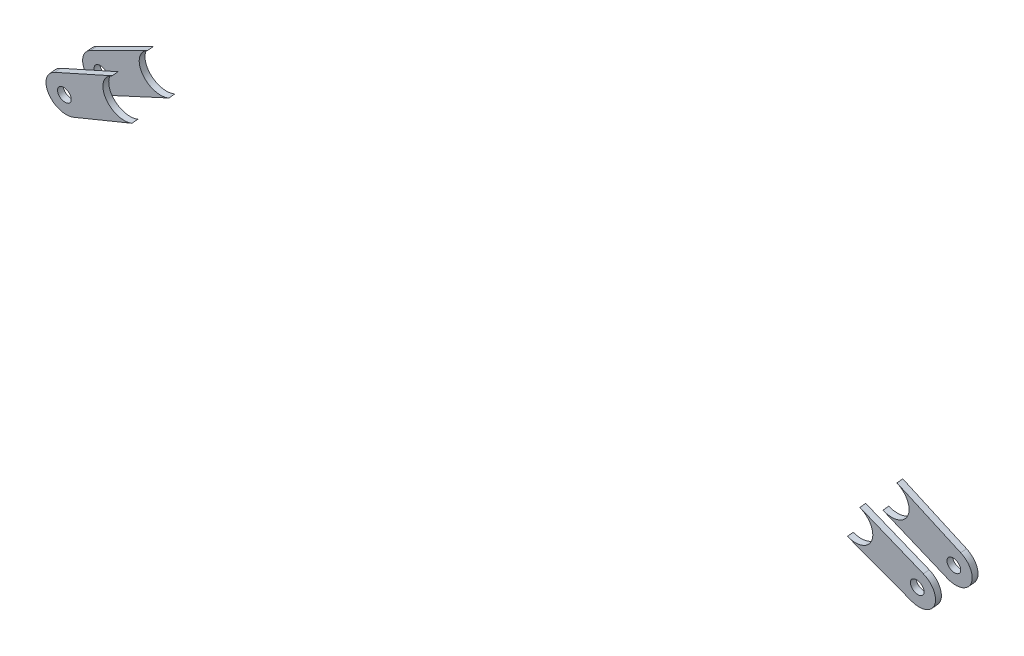
ISO-10303-21;
HEADER;
FILE_DESCRIPTION(('STEP AP214'),'2;1');
FILE_NAME('part.step','',(''),(''),'','','');
FILE_SCHEMA(('AUTOMOTIVE_DESIGN { 1 0 10303 214 1 1 1 1 }'));
ENDSEC;
DATA;
#1=APPLICATION_CONTEXT('core data for automotive mechanical design processes');
#2=APPLICATION_PROTOCOL_DEFINITION('international standard','automotive_design',2000,#1);
#3=PRODUCT_CONTEXT('',#1,'mechanical');
#4=PRODUCT('Part','Part','',(#3));
#5=PRODUCT_RELATED_PRODUCT_CATEGORY('part','',(#4));
#6=PRODUCT_DEFINITION_FORMATION('','',#4);
#7=PRODUCT_DEFINITION_CONTEXT('part definition',#1,'design');
#8=PRODUCT_DEFINITION('design','',#6,#7);
#9=PRODUCT_DEFINITION_SHAPE('','',#8);
#10=(LENGTH_UNIT() NAMED_UNIT(*) SI_UNIT(.MILLI.,.METRE.));
#11=(NAMED_UNIT(*) PLANE_ANGLE_UNIT() SI_UNIT($,.RADIAN.));
#12=(NAMED_UNIT(*) SI_UNIT($,.STERADIAN.) SOLID_ANGLE_UNIT());
#13=UNCERTAINTY_MEASURE_WITH_UNIT(LENGTH_MEASURE(1.E-05),#10,'distance_accuracy_value','');
#14=(GEOMETRIC_REPRESENTATION_CONTEXT(3) GLOBAL_UNCERTAINTY_ASSIGNED_CONTEXT((#13)) GLOBAL_UNIT_ASSIGNED_CONTEXT((#10,
#11,#12)) REPRESENTATION_CONTEXT('',''));
#15=CARTESIAN_POINT('',(0.,0.,0.));
#16=DIRECTION('',(0.,0.,1.));
#17=DIRECTION('',(1.,0.,0.));
#18=AXIS2_PLACEMENT_3D('',#15,#16,#17);
#19=CARTESIAN_POINT('',(-245.963473464093,-1948.0773474311,286.344964969278));
#20=DIRECTION('',(-0.469564839692387,0.878046865754233,0.0924259858688638));
#21=DIRECTION('',(0.881821451796865,0.471583425441214,0.));
#22=AXIS2_PLACEMENT_3D('',#19,#20,#21);
#23=PLANE('',#22);
#24=DIRECTION('',(0.882897990327684,0.466984793574245,0.0491562940604468));
#25=VECTOR('',#24,1.);
#26=CARTESIAN_POINT('',(-245.963473464093,-1948.4803838515,290.173810963026));
#27=LINE('',#26,#25);
#28=CARTESIAN_POINT('',(-285.634778076308,-1969.46343761095,287.965068462031));
#29=VERTEX_POINT('',#28);
#30=CARTESIAN_POINT('',(-245.963473464093,-1948.4803838515,290.173810963026));
#31=VERTEX_POINT('',#30);
#32=EDGE_CURVE('E95',#29,#31,#27,.T.);
#33=ORIENTED_EDGE('',*,*,#32,.T.);
#34=DIRECTION('',(0.,-0.10468478451804,0.994505452921406));
#35=VECTOR('',#34,1.);
#36=CARTESIAN_POINT('',(-245.963473464093,-1948.0773474311,286.344964969278));
#37=LINE('',#36,#35);
#38=CARTESIAN_POINT('',(-245.963473464093,-1948.0773474311,286.344964969278));
#39=VERTEX_POINT('',#38);
#40=EDGE_CURVE('E112',#39,#31,#37,.T.);
#41=ORIENTED_EDGE('',*,*,#40,.F.);
#42=DIRECTION('',(0.882897990327684,0.466984793574245,0.0491562940604468));
#43=VECTOR('',#42,1.);
#44=CARTESIAN_POINT('',(-245.963473464093,-1948.0773474311,286.344964969278));
#45=LINE('',#44,#43);
#46=CARTESIAN_POINT('',(-285.634778076308,-1969.06040119056,284.136222468283));
#47=VERTEX_POINT('',#46);
#48=EDGE_CURVE('E101',#47,#39,#45,.T.);
#49=ORIENTED_EDGE('',*,*,#48,.F.);
#50=DIRECTION('',(0.,-0.10468478451804,0.994505452921406));
#51=VECTOR('',#50,1.);
#52=CARTESIAN_POINT('',(-285.634778076308,-1969.06040119056,284.136222468283));
#53=LINE('',#52,#51);
#54=EDGE_CURVE('E88',#47,#29,#53,.T.);
#55=ORIENTED_EDGE('',*,*,#54,.T.);
#56=EDGE_LOOP('',(#33,#41,#49,#55));
#57=FACE_BOUND('',#56,.T.);
#58=ADVANCED_FACE('F46',(#57),#23,.T.);
#59=CARTESIAN_POINT('',(-279.999999999999,-1979.59696357961,283.027110637857));
#60=DIRECTION('',(0.,-0.10468478451804,0.994505452921406));
#61=DIRECTION('',(0.,-0.994505452921406,-0.10468478451804));
#62=AXIS2_PLACEMENT_3D('',#59,#60,#61);
#63=CYLINDRICAL_SURFACE('',#62,11.9999999999999);
#64=CARTESIAN_POINT('',(-279.999999999999,-1980.,286.855956631604));
#65=DIRECTION('',(0.,0.10468478451804,-0.994505452921406));
#66=DIRECTION('',(0.,0.994505452921406,0.10468478451804));
#67=AXIS2_PLACEMENT_3D('',#64,#65,#66);
#68=CIRCLE('',#67,11.9999999999999);
#69=CARTESIAN_POINT('',(-274.69798258218,-1990.70600761827,285.72900846126));
#70=VERTEX_POINT('',#69);
#71=EDGE_CURVE('E84',#70,#29,#68,.T.);
#72=ORIENTED_EDGE('',*,*,#71,.T.);
#73=ORIENTED_EDGE('',*,*,#54,.F.);
#74=CARTESIAN_POINT('',(-279.999999999999,-1979.59696357961,283.027110637857));
#75=DIRECTION('',(0.,0.10468478451804,-0.994505452921406));
#76=DIRECTION('',(0.,0.994505452921406,0.10468478451804));
#77=AXIS2_PLACEMENT_3D('',#74,#75,#76);
#78=CIRCLE('',#77,11.9999999999999);
#79=CARTESIAN_POINT('',(-274.69798258218,-1990.30297119788,281.900162467513));
#80=VERTEX_POINT('',#79);
#81=EDGE_CURVE('E103',#80,#47,#78,.T.);
#82=ORIENTED_EDGE('',*,*,#81,.F.);
#83=DIRECTION('',(0.,-0.10468478451804,0.994505452921406));
#84=VECTOR('',#83,1.);
#85=CARTESIAN_POINT('',(-274.69798258218,-1990.30297119788,281.900162467513));
#86=LINE('',#85,#84);
#87=EDGE_CURVE('E91',#80,#70,#86,.T.);
#88=ORIENTED_EDGE('',*,*,#87,.T.);
#89=EDGE_LOOP('',(#72,#73,#82,#88));
#90=FACE_BOUND('',#89,.T.);
#91=ADVANCED_FACE('F86',(#90),#63,.T.);
#92=CARTESIAN_POINT('',(-234.388698232807,-1970.55906735552,283.978468135129));
#93=DIRECTION('',(0.441834784818313,-0.892167301522649,-0.0939123475286971));
#94=DIRECTION('',(-0.896127765635472,-0.443796155523206,0.));
#95=AXIS2_PLACEMENT_3D('',#92,#93,#94);
#96=PLANE('',#95);
#97=DIRECTION('',(-0.897096440147075,-0.439407102792168,-0.0462533792412801));
#98=VECTOR('',#97,1.);
#99=CARTESIAN_POINT('',(-234.388698232807,-1970.96210377592,287.807314128876));
#100=LINE('',#99,#98);
#101=CARTESIAN_POINT('',(-234.388698232807,-1970.96210377592,287.807314128876));
#102=VERTEX_POINT('',#101);
#103=EDGE_CURVE('E96',#102,#70,#100,.T.);
#104=ORIENTED_EDGE('',*,*,#103,.T.);
#105=ORIENTED_EDGE('',*,*,#87,.F.);
#106=DIRECTION('',(-0.897096440147075,-0.439407102792168,-0.0462533792412801));
#107=VECTOR('',#106,1.);
#108=CARTESIAN_POINT('',(-234.388698232807,-1970.55906735552,283.978468135129));
#109=LINE('',#108,#107);
#110=CARTESIAN_POINT('',(-234.388698232807,-1970.55906735552,283.978468135129));
#111=VERTEX_POINT('',#110);
#112=EDGE_CURVE('E102',#111,#80,#109,.T.);
#113=ORIENTED_EDGE('',*,*,#112,.F.);
#114=DIRECTION('',(0.,-0.10468478451804,0.994505452921406));
#115=VECTOR('',#114,1.);
#116=CARTESIAN_POINT('',(-234.388698232807,-1970.55906735552,283.978468135129));
#117=LINE('',#116,#115);
#118=EDGE_CURVE('E56',#111,#102,#117,.T.);
#119=ORIENTED_EDGE('',*,*,#118,.T.);
#120=EDGE_LOOP('',(#104,#105,#113,#119));
#121=FACE_BOUND('',#120,.T.);
#122=ADVANCED_FACE('F126',(#121),#96,.T.);
#123=CARTESIAN_POINT('',(-279.999999999999,-1979.59696357961,283.027110637857));
#124=DIRECTION('',(0.,0.10468478451804,-0.994505452921406));
#125=DIRECTION('',(0.,0.994505452921406,0.10468478451804));
#126=AXIS2_PLACEMENT_3D('',#123,#124,#125);
#127=PLANE('',#126);
#128=CARTESIAN_POINT('',(-279.999999999999,-1979.59696357961,283.027110637857));
#129=DIRECTION('',(0.,0.10468478451804,-0.994505452921406));
#130=DIRECTION('',(0.,-0.994505452921406,-0.10468478451804));
#131=AXIS2_PLACEMENT_3D('',#128,#129,#130);
#132=CIRCLE('',#131,4.50000000000004);
#133=CARTESIAN_POINT('',(-279.999999999999,-1984.07223811775,282.556029107526));
#134=VERTEX_POINT('',#133);
#135=EDGE_CURVE('E117',#134,#134,#132,.T.);
#136=ORIENTED_EDGE('',*,*,#135,.F.);
#137=EDGE_LOOP('',(#136));
#138=FACE_BOUND('',#137,.T.);
#139=ORIENTED_EDGE('',*,*,#112,.T.);
#140=ORIENTED_EDGE('',*,*,#81,.T.);
#141=ORIENTED_EDGE('',*,*,#48,.T.);
#142=CARTESIAN_POINT('',(-240.,-1959.22854262618,285.171154948744));
#143=DIRECTION('',(0.,-0.10468478451804,0.994505452921406));
#144=DIRECTION('',(0.,0.994505452921406,0.10468478451804));
#145=AXIS2_PLACEMENT_3D('',#142,#143,#144);
#146=CIRCLE('',#145,12.7);
#147=EDGE_CURVE('E50',#111,#39,#146,.F.);
#148=ORIENTED_EDGE('',*,*,#147,.F.);
#149=EDGE_LOOP('',(#139,#140,#141,#148));
#150=FACE_BOUND('',#149,.T.);
#151=ADVANCED_FACE('F129',(#138,#150),#127,.T.);
#152=CARTESIAN_POINT('',(-279.999999999999,-1980.,286.855956631604));
#153=DIRECTION('',(0.,0.10468478451804,-0.994505452921406));
#154=DIRECTION('',(0.,0.994505452921406,0.10468478451804));
#155=AXIS2_PLACEMENT_3D('',#152,#153,#154);
#156=PLANE('',#155);
#157=CARTESIAN_POINT('',(-240.,-1959.63157904658,289.000000942491));
#158=DIRECTION('',(0.,-0.10468478451804,0.994505452921406));
#159=DIRECTION('',(0.,0.994505452921406,0.10468478451804));
#160=AXIS2_PLACEMENT_3D('',#157,#158,#159);
#161=CIRCLE('',#160,12.7);
#162=EDGE_CURVE('E12',#102,#31,#161,.F.);
#163=ORIENTED_EDGE('',*,*,#162,.T.);
#164=ORIENTED_EDGE('',*,*,#32,.F.);
#165=ORIENTED_EDGE('',*,*,#71,.F.);
#166=ORIENTED_EDGE('',*,*,#103,.F.);
#167=EDGE_LOOP('',(#163,#164,#165,#166));
#168=FACE_BOUND('',#167,.T.);
#169=CARTESIAN_POINT('',(-279.999999999999,-1980.,286.855956631604));
#170=DIRECTION('',(0.,0.10468478451804,-0.994505452921406));
#171=DIRECTION('',(0.,-0.994505452921406,-0.10468478451804));
#172=AXIS2_PLACEMENT_3D('',#169,#170,#171);
#173=CIRCLE('',#172,4.50000000000004);
#174=CARTESIAN_POINT('',(-279.999999999999,-1984.47527453815,286.384875101273));
#175=VERTEX_POINT('',#174);
#176=EDGE_CURVE('E107',#175,#175,#173,.T.);
#177=ORIENTED_EDGE('',*,*,#176,.T.);
#178=EDGE_LOOP('',(#177));
#179=FACE_BOUND('',#178,.T.);
#180=ADVANCED_FACE('F48',(#168,#179),#156,.F.);
#181=CARTESIAN_POINT('',(-279.999999999999,-1979.59696357961,283.027110637857));
#182=DIRECTION('',(0.,-0.10468478451804,0.994505452921406));
#183=DIRECTION('',(0.,-0.994505452921406,-0.10468478451804));
#184=AXIS2_PLACEMENT_3D('',#181,#182,#183);
#185=CYLINDRICAL_SURFACE('',#184,4.50000000000004);
#186=ORIENTED_EDGE('',*,*,#135,.T.);
#187=EDGE_LOOP('',(#186));
#188=FACE_BOUND('',#187,.T.);
#189=ORIENTED_EDGE('',*,*,#176,.F.);
#190=EDGE_LOOP('',(#189));
#191=FACE_BOUND('',#190,.T.);
#192=ADVANCED_FACE('F136',(#188,#191),#185,.F.);
#193=CARTESIAN_POINT('',(-240.,-1935.,55.0000000000016));
#194=DIRECTION('',(0.,-0.104684784518042,0.994505452921406));
#195=DIRECTION('',(0.,-0.994505452921406,-0.104684784518042));
#196=AXIS2_PLACEMENT_3D('',#193,#194,#195);
#197=CYLINDRICAL_SURFACE('',#196,12.7);
#198=ORIENTED_EDGE('',*,*,#118,.F.);
#199=ORIENTED_EDGE('',*,*,#147,.T.);
#200=ORIENTED_EDGE('',*,*,#40,.T.);
#201=ORIENTED_EDGE('',*,*,#162,.F.);
#202=EDGE_LOOP('',(#198,#199,#200,#201));
#203=FACE_BOUND('',#202,.T.);
#204=ADVANCED_FACE('F128',(#203),#197,.F.);
#205=CLOSED_SHELL('',(#58,#91,#122,#151,#180,#192,#204));
#206=MANIFOLD_SOLID_BREP('B2',#205);
#207=CARTESIAN_POINT('',(-279.999999999999,-1980.40303642039,310.906409323086));
#208=DIRECTION('',(0.,0.104684784518042,-0.994505452921406));
#209=DIRECTION('',(0.,0.994505452921406,0.104684784518042));
#210=AXIS2_PLACEMENT_3D('',#207,#208,#209);
#211=PLANE('',#210);
#212=CARTESIAN_POINT('',(-240.,-1962.13987863002,312.82884698523));
#213=DIRECTION('',(0.,-0.104684784518042,0.994505452921406));
#214=DIRECTION('',(0.,0.994505452921406,0.104684784518042));
#215=AXIS2_PLACEMENT_3D('',#212,#213,#214);
#216=CIRCLE('',#215,12.7);
#217=CARTESIAN_POINT('',(-234.885389815801,-1973.70058265674,311.611930771892));
#218=VERTEX_POINT('',#217);
#219=CARTESIAN_POINT('',(-245.481730663648,-1950.74679408441,314.028119042663));
#220=VERTEX_POINT('',#219);
#221=EDGE_CURVE('E212',#218,#220,#216,.F.);
#222=ORIENTED_EDGE('',*,*,#221,.T.);
#223=DIRECTION('',(0.90204962544232,0.429260711531051,0.0451853380558987));
#224=VECTOR('',#223,1.);
#225=CARTESIAN_POINT('',(-245.481730663648,-1950.74679408441,314.028119042663));
#226=LINE('',#225,#224);
#227=CARTESIAN_POINT('',(-285.179588028643,-1969.6379171647,312.039579771054));
#228=VERTEX_POINT('',#227);
#229=EDGE_CURVE('E271',#228,#220,#226,.T.);
#230=ORIENTED_EDGE('',*,*,#229,.F.);
#231=CARTESIAN_POINT('',(-279.999999999999,-1980.40303642039,310.906409323086));
#232=DIRECTION('',(0.,0.104684784518042,-0.994505452921406));
#233=DIRECTION('',(0.,0.994505452921406,0.104684784518042));
#234=AXIS2_PLACEMENT_3D('',#231,#232,#233);
#235=CIRCLE('',#234,12.);
#236=CARTESIAN_POINT('',(-275.167297463749,-1991.32653628816,309.756567231742));
#237=VERTEX_POINT('',#236);
#238=EDGE_CURVE('E248',#237,#228,#235,.T.);
#239=ORIENTED_EDGE('',*,*,#238,.F.);
#240=DIRECTION('',(-0.915320929586836,-0.400512418720683,-0.0421592019705991));
#241=VECTOR('',#240,1.);
#242=CARTESIAN_POINT('',(-234.885389815801,-1973.70058265674,311.611930771892));
#243=LINE('',#242,#241);
#244=EDGE_CURVE('E274',#218,#237,#243,.T.);
#245=ORIENTED_EDGE('',*,*,#244,.F.);
#246=EDGE_LOOP('',(#222,#230,#239,#245));
#247=FACE_BOUND('',#246,.T.);
#248=CARTESIAN_POINT('',(-279.999999999999,-1980.40303642039,310.906409323086));
#249=DIRECTION('',(0.,0.104684784518042,-0.994505452921406));
#250=DIRECTION('',(0.,-0.994505452921406,-0.104684784518042));
#251=AXIS2_PLACEMENT_3D('',#248,#249,#250);
#252=CIRCLE('',#251,4.49999999999997);
#253=CARTESIAN_POINT('',(-279.999999999999,-1984.87831095854,310.435327792755));
#254=VERTEX_POINT('',#253);
#255=EDGE_CURVE('E252',#254,#254,#252,.T.);
#256=ORIENTED_EDGE('',*,*,#255,.T.);
#257=EDGE_LOOP('',(#256));
#258=FACE_BOUND('',#257,.T.);
#259=ADVANCED_FACE('F203',(#247,#258),#211,.F.);
#260=CARTESIAN_POINT('',(-279.999999999999,-1980.,307.077563329339));
#261=DIRECTION('',(0.,0.104684784518042,-0.994505452921406));
#262=DIRECTION('',(0.,0.994505452921406,0.104684784518042));
#263=AXIS2_PLACEMENT_3D('',#260,#261,#262);
#264=PLANE('',#263);
#265=DIRECTION('',(-0.915320929586836,-0.400512418720683,-0.0421592019705991));
#266=VECTOR('',#265,1.);
#267=CARTESIAN_POINT('',(-234.885389815801,-1973.29754623635,307.783084778144));
#268=LINE('',#267,#266);
#269=CARTESIAN_POINT('',(-234.885389815801,-1973.29754623635,307.783084778144));
#270=VERTEX_POINT('',#269);
#271=CARTESIAN_POINT('',(-275.167297463749,-1990.92349986777,305.927721237995));
#272=VERTEX_POINT('',#271);
#273=EDGE_CURVE('E264',#270,#272,#268,.T.);
#274=ORIENTED_EDGE('',*,*,#273,.T.);
#275=CARTESIAN_POINT('',(-279.999999999999,-1980.,307.077563329339));
#276=DIRECTION('',(0.,0.104684784518042,-0.994505452921406));
#277=DIRECTION('',(0.,0.994505452921406,0.104684784518042));
#278=AXIS2_PLACEMENT_3D('',#275,#276,#277);
#279=CIRCLE('',#278,12.);
#280=CARTESIAN_POINT('',(-285.179588028643,-1969.2348807443,308.210733777307));
#281=VERTEX_POINT('',#280);
#282=EDGE_CURVE('E245',#272,#281,#279,.T.);
#283=ORIENTED_EDGE('',*,*,#282,.T.);
#284=DIRECTION('',(0.90204962544232,0.429260711531051,0.0451853380558987));
#285=VECTOR('',#284,1.);
#286=CARTESIAN_POINT('',(-245.481730663648,-1950.34375766402,310.199273048916));
#287=LINE('',#286,#285);
#288=CARTESIAN_POINT('',(-245.481730663648,-1950.34375766402,310.199273048916));
#289=VERTEX_POINT('',#288);
#290=EDGE_CURVE('E253',#281,#289,#287,.T.);
#291=ORIENTED_EDGE('',*,*,#290,.T.);
#292=CARTESIAN_POINT('',(-240.,-1961.73684220963,309.000000991483));
#293=DIRECTION('',(0.,-0.104684784518042,0.994505452921406));
#294=DIRECTION('',(0.,0.994505452921406,0.104684784518042));
#295=AXIS2_PLACEMENT_3D('',#292,#293,#294);
#296=CIRCLE('',#295,12.7);
#297=EDGE_CURVE('E206',#270,#289,#296,.F.);
#298=ORIENTED_EDGE('',*,*,#297,.F.);
#299=EDGE_LOOP('',(#274,#283,#291,#298));
#300=FACE_BOUND('',#299,.T.);
#301=CARTESIAN_POINT('',(-279.999999999999,-1980.,307.077563329339));
#302=DIRECTION('',(0.,0.104684784518042,-0.994505452921406));
#303=DIRECTION('',(0.,-0.994505452921406,-0.104684784518042));
#304=AXIS2_PLACEMENT_3D('',#301,#302,#303);
#305=CIRCLE('',#304,4.49999999999997);
#306=CARTESIAN_POINT('',(-279.999999999999,-1984.47527453815,306.606481799008));
#307=VERTEX_POINT('',#306);
#308=EDGE_CURVE('E270',#307,#307,#305,.T.);
#309=ORIENTED_EDGE('',*,*,#308,.F.);
#310=EDGE_LOOP('',(#309));
#311=FACE_BOUND('',#310,.T.);
#312=ADVANCED_FACE('F262',(#300,#311),#264,.T.);
#313=CARTESIAN_POINT('',(-234.885389815801,-1973.70058265674,311.611930771892));
#314=DIRECTION('',(-0.402725211354206,0.910291655647199,0.0958201742786512));
#315=DIRECTION('',(0.91449957827705,0.404586852642419,0.));
#316=AXIS2_PLACEMENT_3D('',#313,#314,#315);
#317=PLANE('',#316);
#318=ORIENTED_EDGE('',*,*,#273,.F.);
#319=DIRECTION('',(0.,0.104684784518042,-0.994505452921406));
#320=VECTOR('',#319,1.);
#321=CARTESIAN_POINT('',(-234.885389815801,-1973.70058265674,311.611930771892));
#322=LINE('',#321,#320);
#323=EDGE_CURVE('E221',#218,#270,#322,.T.);
#324=ORIENTED_EDGE('',*,*,#323,.F.);
#325=ORIENTED_EDGE('',*,*,#244,.T.);
#326=DIRECTION('',(0.,0.104684784518042,-0.994505452921406));
#327=VECTOR('',#326,1.);
#328=CARTESIAN_POINT('',(-275.167297463749,-1991.32653628816,309.756567231742));
#329=LINE('',#328,#327);
#330=EDGE_CURVE('E260',#237,#272,#329,.T.);
#331=ORIENTED_EDGE('',*,*,#330,.T.);
#332=EDGE_LOOP('',(#318,#324,#325,#331));
#333=FACE_BOUND('',#332,.T.);
#334=ADVANCED_FACE('F285',(#333),#317,.F.);
#335=CARTESIAN_POINT('',(-279.999999999999,-1980.40303642039,310.906409323086));
#336=DIRECTION('',(0.,0.104684784518042,-0.994505452921406));
#337=DIRECTION('',(0.,0.994505452921406,0.104684784518042));
#338=AXIS2_PLACEMENT_3D('',#335,#336,#337);
#339=CYLINDRICAL_SURFACE('',#338,12.);
#340=ORIENTED_EDGE('',*,*,#282,.F.);
#341=ORIENTED_EDGE('',*,*,#330,.F.);
#342=ORIENTED_EDGE('',*,*,#238,.T.);
#343=DIRECTION('',(0.,0.104684784518042,-0.994505452921406));
#344=VECTOR('',#343,1.);
#345=CARTESIAN_POINT('',(-285.179588028643,-1969.6379171647,312.039579771054));
#346=LINE('',#345,#344);
#347=EDGE_CURVE('E241',#228,#281,#346,.T.);
#348=ORIENTED_EDGE('',*,*,#347,.T.);
#349=EDGE_LOOP('',(#340,#341,#342,#348));
#350=FACE_BOUND('',#349,.T.);
#351=ADVANCED_FACE('F243',(#350),#339,.T.);
#352=CARTESIAN_POINT('',(-245.481730663648,-1950.74679408441,314.028119042663));
#353=DIRECTION('',(0.43163233572031,-0.897093271308099,-0.0944308706640091));
#354=DIRECTION('',(-0.901119996991618,-0.433569776416468,0.));
#355=AXIS2_PLACEMENT_3D('',#352,#353,#354);
#356=PLANE('',#355);
#357=ORIENTED_EDGE('',*,*,#290,.F.);
#358=ORIENTED_EDGE('',*,*,#347,.F.);
#359=ORIENTED_EDGE('',*,*,#229,.T.);
#360=DIRECTION('',(0.,0.104684784518042,-0.994505452921406));
#361=VECTOR('',#360,1.);
#362=CARTESIAN_POINT('',(-245.481730663648,-1950.74679408441,314.028119042663));
#363=LINE('',#362,#361);
#364=EDGE_CURVE('E44',#220,#289,#363,.T.);
#365=ORIENTED_EDGE('',*,*,#364,.T.);
#366=EDGE_LOOP('',(#357,#358,#359,#365));
#367=FACE_BOUND('',#366,.T.);
#368=ADVANCED_FACE('F256',(#367),#356,.F.);
#369=CARTESIAN_POINT('',(-279.999999999999,-1980.40303642039,310.906409323086));
#370=DIRECTION('',(0.,0.104684784518042,-0.994505452921406));
#371=DIRECTION('',(0.,0.994505452921406,0.104684784518042));
#372=AXIS2_PLACEMENT_3D('',#369,#370,#371);
#373=CYLINDRICAL_SURFACE('',#372,4.49999999999997);
#374=ORIENTED_EDGE('',*,*,#255,.F.);
#375=EDGE_LOOP('',(#374));
#376=FACE_BOUND('',#375,.T.);
#377=ORIENTED_EDGE('',*,*,#308,.T.);
#378=EDGE_LOOP('',(#377));
#379=FACE_BOUND('',#378,.T.);
#380=ADVANCED_FACE('F319',(#376,#379),#373,.F.);
#381=CARTESIAN_POINT('',(-240.,-1935.,55.0000000000016));
#382=DIRECTION('',(0.,-0.104684784518042,0.994505452921406));
#383=DIRECTION('',(0.,-0.994505452921406,-0.104684784518042));
#384=AXIS2_PLACEMENT_3D('',#381,#382,#383);
#385=CYLINDRICAL_SURFACE('',#384,12.7);
#386=ORIENTED_EDGE('',*,*,#221,.F.);
#387=ORIENTED_EDGE('',*,*,#323,.T.);
#388=ORIENTED_EDGE('',*,*,#297,.T.);
#389=ORIENTED_EDGE('',*,*,#364,.F.);
#390=EDGE_LOOP('',(#386,#387,#388,#389));
#391=FACE_BOUND('',#390,.T.);
#392=ADVANCED_FACE('F284',(#391),#385,.F.);
#393=CLOSED_SHELL('',(#259,#312,#334,#351,#368,#380,#392));
#394=MANIFOLD_SOLID_BREP('B6',#393);
#395=CARTESIAN_POINT('',(245.963473464093,-1948.0773474311,286.344964969278));
#396=DIRECTION('',(0.469564839692387,0.878046865754233,0.0924259858688638));
#397=DIRECTION('',(-0.881821451796865,0.471583425441214,0.));
#398=AXIS2_PLACEMENT_3D('',#395,#396,#397);
#399=PLANE('',#398);
#400=DIRECTION('',(-0.882897990327684,0.466984793574245,0.0491562940604468));
#401=VECTOR('',#400,1.);
#402=CARTESIAN_POINT('',(245.963473464093,-1948.4803838515,290.173810963026));
#403=LINE('',#402,#401);
#404=CARTESIAN_POINT('',(285.634778076308,-1969.46343761095,287.965068462031));
#405=VERTEX_POINT('',#404);
#406=CARTESIAN_POINT('',(245.963473464093,-1948.4803838515,290.173810963026));
#407=VERTEX_POINT('',#406);
#408=EDGE_CURVE('E413',#405,#407,#403,.T.);
#409=ORIENTED_EDGE('',*,*,#408,.F.);
#410=DIRECTION('',(0.,-0.10468478451804,0.994505452921406));
#411=VECTOR('',#410,1.);
#412=CARTESIAN_POINT('',(285.634778076308,-1969.06040119056,284.136222468283));
#413=LINE('',#412,#411);
#414=CARTESIAN_POINT('',(285.634778076308,-1969.06040119056,284.136222468283));
#415=VERTEX_POINT('',#414);
#416=EDGE_CURVE('E396',#415,#405,#413,.T.);
#417=ORIENTED_EDGE('',*,*,#416,.F.);
#418=DIRECTION('',(-0.882897990327684,0.466984793574245,0.0491562940604468));
#419=VECTOR('',#418,1.);
#420=CARTESIAN_POINT('',(245.963473464093,-1948.0773474311,286.344964969278));
#421=LINE('',#420,#419);
#422=CARTESIAN_POINT('',(245.963473464093,-1948.0773474311,286.344964969278));
#423=VERTEX_POINT('',#422);
#424=EDGE_CURVE('E426',#415,#423,#421,.T.);
#425=ORIENTED_EDGE('',*,*,#424,.T.);
#426=DIRECTION('',(0.,-0.10468478451804,0.994505452921406));
#427=VECTOR('',#426,1.);
#428=CARTESIAN_POINT('',(245.963473464093,-1948.0773474311,286.344964969278));
#429=LINE('',#428,#427);
#430=EDGE_CURVE('E418',#423,#407,#429,.T.);
#431=ORIENTED_EDGE('',*,*,#430,.T.);
#432=EDGE_LOOP('',(#409,#417,#425,#431));
#433=FACE_BOUND('',#432,.T.);
#434=ADVANCED_FACE('F359',(#433),#399,.T.);
#435=CARTESIAN_POINT('',(279.999999999999,-1979.59696357961,283.027110637857));
#436=DIRECTION('',(0.,-0.10468478451804,0.994505452921406));
#437=DIRECTION('',(0.,-0.994505452921406,-0.10468478451804));
#438=AXIS2_PLACEMENT_3D('',#435,#436,#437);
#439=CYLINDRICAL_SURFACE('',#438,11.9999999999999);
#440=CARTESIAN_POINT('',(279.999999999999,-1980.,286.855956631604));
#441=DIRECTION('',(0.,-0.10468478451804,0.994505452921406));
#442=DIRECTION('',(0.,0.994505452921406,0.10468478451804));
#443=AXIS2_PLACEMENT_3D('',#440,#441,#442);
#444=CIRCLE('',#443,11.9999999999999);
#445=CARTESIAN_POINT('',(274.69798258218,-1990.70600761827,285.72900846126));
#446=VERTEX_POINT('',#445);
#447=EDGE_CURVE('E399',#446,#405,#444,.T.);
#448=ORIENTED_EDGE('',*,*,#447,.F.);
#449=DIRECTION('',(0.,-0.10468478451804,0.994505452921406));
#450=VECTOR('',#449,1.);
#451=CARTESIAN_POINT('',(274.69798258218,-1990.30297119788,281.900162467513));
#452=LINE('',#451,#450);
#453=CARTESIAN_POINT('',(274.69798258218,-1990.30297119788,281.900162467513));
#454=VERTEX_POINT('',#453);
#455=EDGE_CURVE('E430',#454,#446,#452,.T.);
#456=ORIENTED_EDGE('',*,*,#455,.F.);
#457=CARTESIAN_POINT('',(279.999999999999,-1979.59696357961,283.027110637857));
#458=DIRECTION('',(0.,-0.10468478451804,0.994505452921406));
#459=DIRECTION('',(0.,0.994505452921406,0.10468478451804));
#460=AXIS2_PLACEMENT_3D('',#457,#458,#459);
#461=CIRCLE('',#460,11.9999999999999);
#462=EDGE_CURVE('E402',#454,#415,#461,.T.);
#463=ORIENTED_EDGE('',*,*,#462,.T.);
#464=ORIENTED_EDGE('',*,*,#416,.T.);
#465=EDGE_LOOP('',(#448,#456,#463,#464));
#466=FACE_BOUND('',#465,.T.);
#467=ADVANCED_FACE('F398',(#466),#439,.T.);
#468=CARTESIAN_POINT('',(234.388698232807,-1970.55906735552,283.978468135129));
#469=DIRECTION('',(-0.441834784818313,-0.892167301522649,-0.0939123475286971));
#470=DIRECTION('',(0.896127765635472,-0.443796155523206,0.));
#471=AXIS2_PLACEMENT_3D('',#468,#469,#470);
#472=PLANE('',#471);
#473=DIRECTION('',(0.897096440147075,-0.439407102792168,-0.0462533792412801));
#474=VECTOR('',#473,1.);
#475=CARTESIAN_POINT('',(234.388698232807,-1970.96210377592,287.807314128876));
#476=LINE('',#475,#474);
#477=CARTESIAN_POINT('',(234.388698232807,-1970.96210377592,287.807314128876));
#478=VERTEX_POINT('',#477);
#479=EDGE_CURVE('E415',#478,#446,#476,.T.);
#480=ORIENTED_EDGE('',*,*,#479,.F.);
#481=DIRECTION('',(0.,-0.10468478451804,0.994505452921406));
#482=VECTOR('',#481,1.);
#483=CARTESIAN_POINT('',(234.388698232807,-1970.55906735552,283.978468135129));
#484=LINE('',#483,#482);
#485=CARTESIAN_POINT('',(234.388698232807,-1970.55906735552,283.978468135129));
#486=VERTEX_POINT('',#485);
#487=EDGE_CURVE('E369',#486,#478,#484,.T.);
#488=ORIENTED_EDGE('',*,*,#487,.F.);
#489=DIRECTION('',(0.897096440147075,-0.439407102792168,-0.0462533792412801));
#490=VECTOR('',#489,1.);
#491=CARTESIAN_POINT('',(234.388698232807,-1970.55906735552,283.978468135129));
#492=LINE('',#491,#490);
#493=EDGE_CURVE('E407',#486,#454,#492,.T.);
#494=ORIENTED_EDGE('',*,*,#493,.T.);
#495=ORIENTED_EDGE('',*,*,#455,.T.);
#496=EDGE_LOOP('',(#480,#488,#494,#495));
#497=FACE_BOUND('',#496,.T.);
#498=ADVANCED_FACE('F440',(#497),#472,.T.);
#499=CARTESIAN_POINT('',(279.999999999999,-1979.59696357961,283.027110637857));
#500=DIRECTION('',(0.,0.10468478451804,-0.994505452921406));
#501=DIRECTION('',(0.,0.994505452921406,0.10468478451804));
#502=AXIS2_PLACEMENT_3D('',#499,#500,#501);
#503=PLANE('',#502);
#504=CARTESIAN_POINT('',(279.999999999999,-1979.59696357961,283.027110637857));
#505=DIRECTION('',(0.,-0.10468478451804,0.994505452921406));
#506=DIRECTION('',(0.,-0.994505452921406,-0.10468478451804));
#507=AXIS2_PLACEMENT_3D('',#504,#505,#506);
#508=CIRCLE('',#507,4.50000000000004);
#509=CARTESIAN_POINT('',(279.999999999999,-1984.07223811775,282.556029107526));
#510=VERTEX_POINT('',#509);
#511=EDGE_CURVE('E431',#510,#510,#508,.T.);
#512=ORIENTED_EDGE('',*,*,#511,.T.);
#513=EDGE_LOOP('',(#512));
#514=FACE_BOUND('',#513,.T.);
#515=ORIENTED_EDGE('',*,*,#493,.F.);
#516=CARTESIAN_POINT('',(240.,-1959.22854262618,285.171154948744));
#517=DIRECTION('',(0.,0.10468478451804,-0.994505452921406));
#518=DIRECTION('',(0.,0.994505452921406,0.10468478451804));
#519=AXIS2_PLACEMENT_3D('',#516,#517,#518);
#520=CIRCLE('',#519,12.7);
#521=EDGE_CURVE('E363',#486,#423,#520,.F.);
#522=ORIENTED_EDGE('',*,*,#521,.T.);
#523=ORIENTED_EDGE('',*,*,#424,.F.);
#524=ORIENTED_EDGE('',*,*,#462,.F.);
#525=EDGE_LOOP('',(#515,#522,#523,#524));
#526=FACE_BOUND('',#525,.T.);
#527=ADVANCED_FACE('F442',(#514,#526),#503,.T.);
#528=CARTESIAN_POINT('',(279.999999999999,-1980.,286.855956631604));
#529=DIRECTION('',(0.,0.10468478451804,-0.994505452921406));
#530=DIRECTION('',(0.,0.994505452921406,0.10468478451804));
#531=AXIS2_PLACEMENT_3D('',#528,#529,#530);
#532=PLANE('',#531);
#533=CARTESIAN_POINT('',(240.,-1959.63157904658,289.000000942491));
#534=DIRECTION('',(0.,0.10468478451804,-0.994505452921406));
#535=DIRECTION('',(0.,0.994505452921406,0.10468478451804));
#536=AXIS2_PLACEMENT_3D('',#533,#534,#535);
#537=CIRCLE('',#536,12.7);
#538=EDGE_CURVE('E201',#478,#407,#537,.F.);
#539=ORIENTED_EDGE('',*,*,#538,.F.);
#540=ORIENTED_EDGE('',*,*,#479,.T.);
#541=ORIENTED_EDGE('',*,*,#447,.T.);
#542=ORIENTED_EDGE('',*,*,#408,.T.);
#543=EDGE_LOOP('',(#539,#540,#541,#542));
#544=FACE_BOUND('',#543,.T.);
#545=CARTESIAN_POINT('',(279.999999999999,-1980.,286.855956631604));
#546=DIRECTION('',(0.,-0.10468478451804,0.994505452921406));
#547=DIRECTION('',(0.,-0.994505452921406,-0.10468478451804));
#548=AXIS2_PLACEMENT_3D('',#545,#546,#547);
#549=CIRCLE('',#548,4.50000000000004);
#550=CARTESIAN_POINT('',(279.999999999999,-1984.47527453815,286.384875101273));
#551=VERTEX_POINT('',#550);
#552=EDGE_CURVE('E419',#551,#551,#549,.T.);
#553=ORIENTED_EDGE('',*,*,#552,.F.);
#554=EDGE_LOOP('',(#553));
#555=FACE_BOUND('',#554,.T.);
#556=ADVANCED_FACE('F361',(#544,#555),#532,.F.);
#557=CARTESIAN_POINT('',(279.999999999999,-1979.59696357961,283.027110637857));
#558=DIRECTION('',(0.,-0.10468478451804,0.994505452921406));
#559=DIRECTION('',(0.,-0.994505452921406,-0.10468478451804));
#560=AXIS2_PLACEMENT_3D('',#557,#558,#559);
#561=CYLINDRICAL_SURFACE('',#560,4.50000000000004);
#562=ORIENTED_EDGE('',*,*,#511,.F.);
#563=EDGE_LOOP('',(#562));
#564=FACE_BOUND('',#563,.T.);
#565=ORIENTED_EDGE('',*,*,#552,.T.);
#566=EDGE_LOOP('',(#565));
#567=FACE_BOUND('',#566,.T.);
#568=ADVANCED_FACE('F454',(#564,#567),#561,.F.);
#569=CARTESIAN_POINT('',(240.,-1935.,55.0000000000016));
#570=DIRECTION('',(0.,-0.104684784518042,0.994505452921406));
#571=DIRECTION('',(0.,-0.994505452921406,-0.104684784518042));
#572=AXIS2_PLACEMENT_3D('',#569,#570,#571);
#573=CYLINDRICAL_SURFACE('',#572,12.7);
#574=ORIENTED_EDGE('',*,*,#487,.T.);
#575=ORIENTED_EDGE('',*,*,#538,.T.);
#576=ORIENTED_EDGE('',*,*,#430,.F.);
#577=ORIENTED_EDGE('',*,*,#521,.F.);
#578=EDGE_LOOP('',(#574,#575,#576,#577));
#579=FACE_BOUND('',#578,.T.);
#580=ADVANCED_FACE('F438',(#579),#573,.F.);
#581=CLOSED_SHELL('',(#434,#467,#498,#527,#556,#568,#580));
#582=MANIFOLD_SOLID_BREP('B38',#581);
#583=CARTESIAN_POINT('',(279.999999999999,-1980.40303642039,310.906409323086));
#584=DIRECTION('',(0.,0.104684784518042,-0.994505452921406));
#585=DIRECTION('',(0.,0.994505452921406,0.104684784518042));
#586=AXIS2_PLACEMENT_3D('',#583,#584,#585);
#587=PLANE('',#586);
#588=CARTESIAN_POINT('',(240.,-1962.13987863002,312.82884698523));
#589=DIRECTION('',(0.,0.104684784518042,-0.994505452921406));
#590=DIRECTION('',(0.,0.994505452921406,0.104684784518042));
#591=AXIS2_PLACEMENT_3D('',#588,#589,#590);
#592=CIRCLE('',#591,12.7);
#593=CARTESIAN_POINT('',(234.885389815801,-1973.70058265674,311.611930771892));
#594=VERTEX_POINT('',#593);
#595=CARTESIAN_POINT('',(245.481730663648,-1950.74679408441,314.028119042663));
#596=VERTEX_POINT('',#595);
#597=EDGE_CURVE('E515',#594,#596,#592,.F.);
#598=ORIENTED_EDGE('',*,*,#597,.F.);
#599=DIRECTION('',(0.915320929586836,-0.400512418720683,-0.0421592019705991));
#600=VECTOR('',#599,1.);
#601=CARTESIAN_POINT('',(234.885389815801,-1973.70058265674,311.611930771892));
#602=LINE('',#601,#600);
#603=CARTESIAN_POINT('',(275.167297463749,-1991.32653628816,309.756567231742));
#604=VERTEX_POINT('',#603);
#605=EDGE_CURVE('E577',#594,#604,#602,.T.);
#606=ORIENTED_EDGE('',*,*,#605,.T.);
#607=CARTESIAN_POINT('',(279.999999999999,-1980.40303642039,310.906409323086));
#608=DIRECTION('',(0.,-0.104684784518042,0.994505452921406));
#609=DIRECTION('',(0.,0.994505452921406,0.104684784518042));
#610=AXIS2_PLACEMENT_3D('',#607,#608,#609);
#611=CIRCLE('',#610,12.);
#612=CARTESIAN_POINT('',(285.179588028643,-1969.6379171647,312.039579771054));
#613=VERTEX_POINT('',#612);
#614=EDGE_CURVE('E575',#604,#613,#611,.T.);
#615=ORIENTED_EDGE('',*,*,#614,.T.);
#616=DIRECTION('',(-0.90204962544232,0.429260711531051,0.0451853380558987));
#617=VECTOR('',#616,1.);
#618=CARTESIAN_POINT('',(245.481730663648,-1950.74679408441,314.028119042663));
#619=LINE('',#618,#617);
#620=EDGE_CURVE('E562',#613,#596,#619,.T.);
#621=ORIENTED_EDGE('',*,*,#620,.T.);
#622=EDGE_LOOP('',(#598,#606,#615,#621));
#623=FACE_BOUND('',#622,.T.);
#624=CARTESIAN_POINT('',(279.999999999999,-1980.40303642039,310.906409323086));
#625=DIRECTION('',(0.,-0.104684784518042,0.994505452921406));
#626=DIRECTION('',(0.,-0.994505452921406,-0.104684784518042));
#627=AXIS2_PLACEMENT_3D('',#624,#625,#626);
#628=CIRCLE('',#627,4.49999999999997);
#629=CARTESIAN_POINT('',(279.999999999999,-1984.87831095854,310.435327792755));
#630=VERTEX_POINT('',#629);
#631=EDGE_CURVE('E563',#630,#630,#628,.T.);
#632=ORIENTED_EDGE('',*,*,#631,.F.);
#633=EDGE_LOOP('',(#632));
#634=FACE_BOUND('',#633,.T.);
#635=ADVANCED_FACE('F506',(#623,#634),#587,.F.);
#636=CARTESIAN_POINT('',(279.999999999999,-1980.,307.077563329339));
#637=DIRECTION('',(0.,0.104684784518042,-0.994505452921406));
#638=DIRECTION('',(0.,0.994505452921406,0.104684784518042));
#639=AXIS2_PLACEMENT_3D('',#636,#637,#638);
#640=PLANE('',#639);
#641=DIRECTION('',(0.915320929586836,-0.400512418720683,-0.0421592019705991));
#642=VECTOR('',#641,1.);
#643=CARTESIAN_POINT('',(234.885389815801,-1973.29754623635,307.783084778144));
#644=LINE('',#643,#642);
#645=CARTESIAN_POINT('',(234.885389815801,-1973.29754623635,307.783084778144));
#646=VERTEX_POINT('',#645);
#647=CARTESIAN_POINT('',(275.167297463749,-1990.92349986777,305.927721237995));
#648=VERTEX_POINT('',#647);
#649=EDGE_CURVE('E571',#646,#648,#644,.T.);
#650=ORIENTED_EDGE('',*,*,#649,.F.);
#651=CARTESIAN_POINT('',(240.,-1961.73684220963,309.000000991483));
#652=DIRECTION('',(0.,0.104684784518042,-0.994505452921406));
#653=DIRECTION('',(0.,0.994505452921406,0.104684784518042));
#654=AXIS2_PLACEMENT_3D('',#651,#652,#653);
#655=CIRCLE('',#654,12.7);
#656=CARTESIAN_POINT('',(245.481730663648,-1950.34375766402,310.199273048916));
#657=VERTEX_POINT('',#656);
#658=EDGE_CURVE('E509',#646,#657,#655,.F.);
#659=ORIENTED_EDGE('',*,*,#658,.T.);
#660=DIRECTION('',(-0.90204962544232,0.429260711531051,0.0451853380558987));
#661=VECTOR('',#660,1.);
#662=CARTESIAN_POINT('',(245.481730663648,-1950.34375766402,310.199273048916));
#663=LINE('',#662,#661);
#664=CARTESIAN_POINT('',(285.179588028643,-1969.2348807443,308.210733777307));
#665=VERTEX_POINT('',#664);
#666=EDGE_CURVE('E560',#665,#657,#663,.T.);
#667=ORIENTED_EDGE('',*,*,#666,.F.);
#668=CARTESIAN_POINT('',(279.999999999999,-1980.,307.077563329339));
#669=DIRECTION('',(0.,-0.104684784518042,0.994505452921406));
#670=DIRECTION('',(0.,0.994505452921406,0.104684784518042));
#671=AXIS2_PLACEMENT_3D('',#668,#669,#670);
#672=CIRCLE('',#671,12.);
#673=EDGE_CURVE('E544',#648,#665,#672,.T.);
#674=ORIENTED_EDGE('',*,*,#673,.F.);
#675=EDGE_LOOP('',(#650,#659,#667,#674));
#676=FACE_BOUND('',#675,.T.);
#677=CARTESIAN_POINT('',(279.999999999999,-1980.,307.077563329339));
#678=DIRECTION('',(0.,-0.104684784518042,0.994505452921406));
#679=DIRECTION('',(0.,-0.994505452921406,-0.104684784518042));
#680=AXIS2_PLACEMENT_3D('',#677,#678,#679);
#681=CIRCLE('',#680,4.49999999999997);
#682=CARTESIAN_POINT('',(279.999999999999,-1984.47527453815,306.606481799008));
#683=VERTEX_POINT('',#682);
#684=EDGE_CURVE('E573',#683,#683,#681,.T.);
#685=ORIENTED_EDGE('',*,*,#684,.T.);
#686=EDGE_LOOP('',(#685));
#687=FACE_BOUND('',#686,.T.);
#688=ADVANCED_FACE('F566',(#676,#687),#640,.T.);
#689=CARTESIAN_POINT('',(234.885389815801,-1973.70058265674,311.611930771892));
#690=DIRECTION('',(0.402725211354206,0.910291655647199,0.0958201742786512));
#691=DIRECTION('',(-0.91449957827705,0.404586852642419,0.));
#692=AXIS2_PLACEMENT_3D('',#689,#690,#691);
#693=PLANE('',#692);
#694=ORIENTED_EDGE('',*,*,#649,.T.);
#695=DIRECTION('',(0.,0.104684784518042,-0.994505452921406));
#696=VECTOR('',#695,1.);
#697=CARTESIAN_POINT('',(275.167297463749,-1991.32653628816,309.756567231742));
#698=LINE('',#697,#696);
#699=EDGE_CURVE('E551',#604,#648,#698,.T.);
#700=ORIENTED_EDGE('',*,*,#699,.F.);
#701=ORIENTED_EDGE('',*,*,#605,.F.);
#702=DIRECTION('',(0.,0.104684784518042,-0.994505452921406));
#703=VECTOR('',#702,1.);
#704=CARTESIAN_POINT('',(234.885389815801,-1973.70058265674,311.611930771892));
#705=LINE('',#704,#703);
#706=EDGE_CURVE('E524',#594,#646,#705,.T.);
#707=ORIENTED_EDGE('',*,*,#706,.T.);
#708=EDGE_LOOP('',(#694,#700,#701,#707));
#709=FACE_BOUND('',#708,.T.);
#710=ADVANCED_FACE('F587',(#709),#693,.F.);
#711=CARTESIAN_POINT('',(279.999999999999,-1980.40303642039,310.906409323086));
#712=DIRECTION('',(0.,0.104684784518042,-0.994505452921406));
#713=DIRECTION('',(0.,0.994505452921406,0.104684784518042));
#714=AXIS2_PLACEMENT_3D('',#711,#712,#713);
#715=CYLINDRICAL_SURFACE('',#714,12.);
#716=ORIENTED_EDGE('',*,*,#673,.T.);
#717=DIRECTION('',(0.,0.104684784518042,-0.994505452921406));
#718=VECTOR('',#717,1.);
#719=CARTESIAN_POINT('',(285.179588028643,-1969.6379171647,312.039579771054));
#720=LINE('',#719,#718);
#721=EDGE_CURVE('E548',#613,#665,#720,.T.);
#722=ORIENTED_EDGE('',*,*,#721,.F.);
#723=ORIENTED_EDGE('',*,*,#614,.F.);
#724=ORIENTED_EDGE('',*,*,#699,.T.);
#725=EDGE_LOOP('',(#716,#722,#723,#724));
#726=FACE_BOUND('',#725,.T.);
#727=ADVANCED_FACE('F546',(#726),#715,.T.);
#728=CARTESIAN_POINT('',(245.481730663648,-1950.74679408441,314.028119042663));
#729=DIRECTION('',(-0.43163233572031,-0.897093271308099,-0.0944308706640091));
#730=DIRECTION('',(0.901119996991618,-0.433569776416468,0.));
#731=AXIS2_PLACEMENT_3D('',#728,#729,#730);
#732=PLANE('',#731);
#733=ORIENTED_EDGE('',*,*,#666,.T.);
#734=DIRECTION('',(0.,0.104684784518042,-0.994505452921406));
#735=VECTOR('',#734,1.);
#736=CARTESIAN_POINT('',(245.481730663648,-1950.74679408441,314.028119042663));
#737=LINE('',#736,#735);
#738=EDGE_CURVE('E357',#596,#657,#737,.T.);
#739=ORIENTED_EDGE('',*,*,#738,.F.);
#740=ORIENTED_EDGE('',*,*,#620,.F.);
#741=ORIENTED_EDGE('',*,*,#721,.T.);
#742=EDGE_LOOP('',(#733,#739,#740,#741));
#743=FACE_BOUND('',#742,.T.);
#744=ADVANCED_FACE('F558',(#743),#732,.F.);
#745=CARTESIAN_POINT('',(279.999999999999,-1980.40303642039,310.906409323086));
#746=DIRECTION('',(0.,0.104684784518042,-0.994505452921406));
#747=DIRECTION('',(0.,0.994505452921406,0.104684784518042));
#748=AXIS2_PLACEMENT_3D('',#745,#746,#747);
#749=CYLINDRICAL_SURFACE('',#748,4.49999999999997);
#750=ORIENTED_EDGE('',*,*,#631,.T.);
#751=EDGE_LOOP('',(#750));
#752=FACE_BOUND('',#751,.T.);
#753=ORIENTED_EDGE('',*,*,#684,.F.);
#754=EDGE_LOOP('',(#753));
#755=FACE_BOUND('',#754,.T.);
#756=ADVANCED_FACE('F622',(#752,#755),#749,.F.);
#757=CARTESIAN_POINT('',(240.,-1935.,55.0000000000016));
#758=DIRECTION('',(0.,-0.104684784518042,0.994505452921406));
#759=DIRECTION('',(0.,-0.994505452921406,-0.104684784518042));
#760=AXIS2_PLACEMENT_3D('',#757,#758,#759);
#761=CYLINDRICAL_SURFACE('',#760,12.7);
#762=ORIENTED_EDGE('',*,*,#597,.T.);
#763=ORIENTED_EDGE('',*,*,#738,.T.);
#764=ORIENTED_EDGE('',*,*,#658,.F.);
#765=ORIENTED_EDGE('',*,*,#706,.F.);
#766=EDGE_LOOP('',(#762,#763,#764,#765));
#767=FACE_BOUND('',#766,.T.);
#768=ADVANCED_FACE('F582',(#767),#761,.F.);
#769=CLOSED_SHELL('',(#635,#688,#710,#727,#744,#756,#768));
#770=MANIFOLD_SOLID_BREP('B195',#769);
#771=ADVANCED_BREP_SHAPE_REPRESENTATION('',(#18,#206,#394,#582,#770),#14);
#772=SHAPE_DEFINITION_REPRESENTATION(#9,#771);
ENDSEC;
END-ISO-10303-21;
